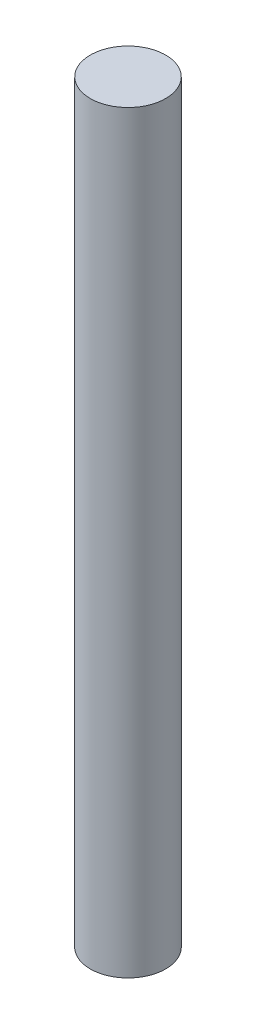
ISO-10303-21;
HEADER;
FILE_DESCRIPTION(('STEP AP214'),'2;1');
FILE_NAME('part.step','',(''),(''),'','','');
FILE_SCHEMA(('AUTOMOTIVE_DESIGN { 1 0 10303 214 1 1 1 1 }'));
ENDSEC;
DATA;
#1=APPLICATION_CONTEXT('core data for automotive mechanical design processes');
#2=APPLICATION_PROTOCOL_DEFINITION('international standard','automotive_design',2000,#1);
#3=PRODUCT_CONTEXT('',#1,'mechanical');
#4=PRODUCT('Part','Part','',(#3));
#5=PRODUCT_RELATED_PRODUCT_CATEGORY('part','',(#4));
#6=PRODUCT_DEFINITION_FORMATION('','',#4);
#7=PRODUCT_DEFINITION_CONTEXT('part definition',#1,'design');
#8=PRODUCT_DEFINITION('design','',#6,#7);
#9=PRODUCT_DEFINITION_SHAPE('','',#8);
#10=(LENGTH_UNIT() NAMED_UNIT(*) SI_UNIT(.MILLI.,.METRE.));
#11=(NAMED_UNIT(*) PLANE_ANGLE_UNIT() SI_UNIT($,.RADIAN.));
#12=(NAMED_UNIT(*) SI_UNIT($,.STERADIAN.) SOLID_ANGLE_UNIT());
#13=UNCERTAINTY_MEASURE_WITH_UNIT(LENGTH_MEASURE(1.E-05),#10,'distance_accuracy_value','');
#14=(GEOMETRIC_REPRESENTATION_CONTEXT(3) GLOBAL_UNCERTAINTY_ASSIGNED_CONTEXT((#13)) GLOBAL_UNIT_ASSIGNED_CONTEXT((#10,
#11,#12)) REPRESENTATION_CONTEXT('',''));
#15=CARTESIAN_POINT('',(0.,0.,0.));
#16=DIRECTION('',(0.,0.,1.));
#17=DIRECTION('',(1.,0.,0.));
#18=AXIS2_PLACEMENT_3D('',#15,#16,#17);
#19=CARTESIAN_POINT('',(0.,200.,0.));
#20=DIRECTION('',(0.,-1.,0.));
#21=DIRECTION('',(0.,0.,-1.));
#22=AXIS2_PLACEMENT_3D('',#19,#20,#21);
#23=CYLINDRICAL_SURFACE('',#22,10.);
#24=CARTESIAN_POINT('',(0.,200.,0.));
#25=DIRECTION('',(0.,1.,0.));
#26=DIRECTION('',(0.,0.,1.));
#27=AXIS2_PLACEMENT_3D('',#24,#25,#26);
#28=CIRCLE('',#27,10.);
#29=CARTESIAN_POINT('',(0.,200.,10.));
#30=VERTEX_POINT('',#29);
#31=EDGE_CURVE('E10',#30,#30,#28,.T.);
#32=ORIENTED_EDGE('',*,*,#31,.F.);
#33=EDGE_LOOP('',(#32));
#34=FACE_BOUND('',#33,.T.);
#35=CARTESIAN_POINT('',(0.,0.,0.));
#36=DIRECTION('',(0.,1.,0.));
#37=DIRECTION('',(0.,0.,1.));
#38=AXIS2_PLACEMENT_3D('',#35,#36,#37);
#39=CIRCLE('',#38,10.);
#40=CARTESIAN_POINT('',(0.,0.,10.));
#41=VERTEX_POINT('',#40);
#42=EDGE_CURVE('E44',#41,#41,#39,.T.);
#43=ORIENTED_EDGE('',*,*,#42,.T.);
#44=EDGE_LOOP('',(#43));
#45=FACE_BOUND('',#44,.T.);
#46=ADVANCED_FACE('F41',(#34,#45),#23,.T.);
#47=CARTESIAN_POINT('',(0.,200.,0.));
#48=DIRECTION('',(0.,1.,0.));
#49=DIRECTION('',(0.,0.,1.));
#50=AXIS2_PLACEMENT_3D('',#47,#48,#49);
#51=PLANE('',#50);
#52=ORIENTED_EDGE('',*,*,#31,.T.);
#53=EDGE_LOOP('',(#52));
#54=FACE_BOUND('',#53,.T.);
#55=ADVANCED_FACE('F58',(#54),#51,.T.);
#56=CARTESIAN_POINT('',(0.,0.,0.));
#57=DIRECTION('',(0.,1.,0.));
#58=DIRECTION('',(0.,0.,1.));
#59=AXIS2_PLACEMENT_3D('',#56,#57,#58);
#60=PLANE('',#59);
#61=ORIENTED_EDGE('',*,*,#42,.F.);
#62=EDGE_LOOP('',(#61));
#63=FACE_BOUND('',#62,.T.);
#64=ADVANCED_FACE('F56',(#63),#60,.F.);
#65=CLOSED_SHELL('',(#46,#55,#64));
#66=MANIFOLD_SOLID_BREP('B2',#65);
#67=ADVANCED_BREP_SHAPE_REPRESENTATION('',(#18,#66),#14);
#68=SHAPE_DEFINITION_REPRESENTATION(#9,#67);
ENDSEC;
END-ISO-10303-21;
